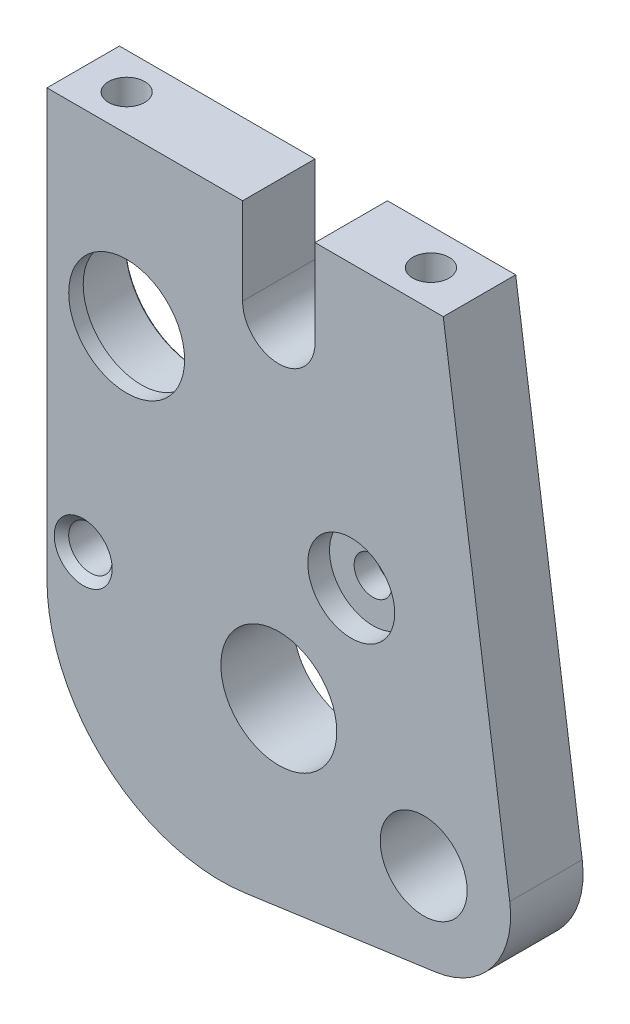
ISO-10303-21;
HEADER;
FILE_DESCRIPTION(('STEP AP214'),'2;1');
FILE_NAME('part.step','',(''),(''),'','','');
FILE_SCHEMA(('AUTOMOTIVE_DESIGN { 1 0 10303 214 1 1 1 1 }'));
ENDSEC;
DATA;
#1=APPLICATION_CONTEXT('core data for automotive mechanical design processes');
#2=APPLICATION_PROTOCOL_DEFINITION('international standard','automotive_design',2000,#1);
#3=PRODUCT_CONTEXT('',#1,'mechanical');
#4=PRODUCT('Part','Part','',(#3));
#5=PRODUCT_RELATED_PRODUCT_CATEGORY('part','',(#4));
#6=PRODUCT_DEFINITION_FORMATION('','',#4);
#7=PRODUCT_DEFINITION_CONTEXT('part definition',#1,'design');
#8=PRODUCT_DEFINITION('design','',#6,#7);
#9=PRODUCT_DEFINITION_SHAPE('','',#8);
#10=(LENGTH_UNIT() NAMED_UNIT(*) SI_UNIT(.MILLI.,.METRE.));
#11=(NAMED_UNIT(*) PLANE_ANGLE_UNIT() SI_UNIT($,.RADIAN.));
#12=(NAMED_UNIT(*) SI_UNIT($,.STERADIAN.) SOLID_ANGLE_UNIT());
#13=UNCERTAINTY_MEASURE_WITH_UNIT(LENGTH_MEASURE(1.E-05),#10,'distance_accuracy_value','');
#14=(GEOMETRIC_REPRESENTATION_CONTEXT(3) GLOBAL_UNCERTAINTY_ASSIGNED_CONTEXT((#13)) GLOBAL_UNIT_ASSIGNED_CONTEXT((#10,
#11,#12)) REPRESENTATION_CONTEXT('',''));
#15=CARTESIAN_POINT('',(0.,0.,0.));
#16=DIRECTION('',(0.,0.,1.));
#17=DIRECTION('',(1.,0.,0.));
#18=AXIS2_PLACEMENT_3D('',#15,#16,#17);
#19=CARTESIAN_POINT('',(0.,0.,5.));
#20=DIRECTION('',(0.,-1.,0.));
#21=DIRECTION('',(0.,0.,-1.));
#22=AXIS2_PLACEMENT_3D('',#19,#20,#21);
#23=PLANE('',#22);
#24=CARTESIAN_POINT('',(24.,0.,2.5));
#25=DIRECTION('',(0.,1.,0.));
#26=DIRECTION('',(0.,0.,1.));
#27=AXIS2_PLACEMENT_3D('',#24,#25,#26);
#28=CIRCLE('',#27,1.25);
#29=CARTESIAN_POINT('',(24.,0.,3.75));
#30=VERTEX_POINT('',#29);
#31=EDGE_CURVE('E719',#30,#30,#28,.T.);
#32=ORIENTED_EDGE('',*,*,#31,.F.);
#33=EDGE_LOOP('',(#32));
#34=FACE_BOUND('',#33,.T.);
#35=DIRECTION('',(-1.,0.,0.));
#36=VECTOR('',#35,1.);
#37=CARTESIAN_POINT('',(0.,0.,0.));
#38=LINE('',#37,#36);
#39=CARTESIAN_POINT('',(27.3508474725816,0.,0.));
#40=VERTEX_POINT('',#39);
#41=CARTESIAN_POINT('',(18.5,0.,0.));
#42=VERTEX_POINT('',#41);
#43=EDGE_CURVE('E319',#40,#42,#38,.T.);
#44=ORIENTED_EDGE('',*,*,#43,.T.);
#45=DIRECTION('',(0.,0.,-1.));
#46=VECTOR('',#45,1.);
#47=CARTESIAN_POINT('',(18.5,0.,5.));
#48=LINE('',#47,#46);
#49=CARTESIAN_POINT('',(18.5,0.,5.));
#50=VERTEX_POINT('',#49);
#51=EDGE_CURVE('E194',#50,#42,#48,.T.);
#52=ORIENTED_EDGE('',*,*,#51,.F.);
#53=DIRECTION('',(-1.,0.,0.));
#54=VECTOR('',#53,1.);
#55=CARTESIAN_POINT('',(0.,0.,5.));
#56=LINE('',#55,#54);
#57=CARTESIAN_POINT('',(27.3508474725816,0.,5.));
#58=VERTEX_POINT('',#57);
#59=EDGE_CURVE('E320',#58,#50,#56,.T.);
#60=ORIENTED_EDGE('',*,*,#59,.F.);
#61=DIRECTION('',(0.,0.,-1.));
#62=VECTOR('',#61,1.);
#63=CARTESIAN_POINT('',(27.3508474725816,0.,10.));
#64=LINE('',#63,#62);
#65=EDGE_CURVE('E293',#58,#40,#64,.T.);
#66=ORIENTED_EDGE('',*,*,#65,.T.);
#67=EDGE_LOOP('',(#44,#52,#60,#66));
#68=FACE_BOUND('',#67,.T.);
#69=ADVANCED_FACE('F34',(#34,#68),#23,.F.);
#70=CARTESIAN_POINT('',(2.5,-26.5,0.5));
#71=DIRECTION('',(0.,0.,1.));
#72=DIRECTION('',(1.,0.,0.));
#73=AXIS2_PLACEMENT_3D('',#70,#71,#72);
#74=CYLINDRICAL_SURFACE('',#73,1.5);
#75=CARTESIAN_POINT('',(2.5,-26.5,4.5));
#76=DIRECTION('',(0.,0.,1.));
#77=DIRECTION('',(1.,0.,0.));
#78=AXIS2_PLACEMENT_3D('',#75,#76,#77);
#79=CIRCLE('',#78,1.5);
#80=CARTESIAN_POINT('',(4.,-26.5,4.5));
#81=VERTEX_POINT('',#80);
#82=EDGE_CURVE('E42',#81,#81,#79,.T.);
#83=ORIENTED_EDGE('',*,*,#82,.T.);
#84=EDGE_LOOP('',(#83));
#85=FACE_BOUND('',#84,.T.);
#86=CARTESIAN_POINT('',(2.5,-26.5,0.));
#87=DIRECTION('',(0.,0.,1.));
#88=DIRECTION('',(1.,0.,0.));
#89=AXIS2_PLACEMENT_3D('',#86,#87,#88);
#90=CIRCLE('',#89,1.5);
#91=CARTESIAN_POINT('',(4.,-26.5,0.));
#92=VERTEX_POINT('',#91);
#93=EDGE_CURVE('E185',#92,#92,#90,.T.);
#94=ORIENTED_EDGE('',*,*,#93,.F.);
#95=EDGE_LOOP('',(#94));
#96=FACE_BOUND('',#95,.T.);
#97=ADVANCED_FACE('F343',(#85,#96),#74,.F.);
#98=CARTESIAN_POINT('',(5.5,-11.5,16.3137084989848));
#99=DIRECTION('',(0.,0.,-1.));
#100=DIRECTION('',(-1.,0.,0.));
#101=AXIS2_PLACEMENT_3D('',#98,#99,#100);
#102=CYLINDRICAL_SURFACE('',#101,4.);
#103=CARTESIAN_POINT('',(5.5,-11.5,5.));
#104=DIRECTION('',(0.,0.,1.));
#105=DIRECTION('',(1.,0.,0.));
#106=AXIS2_PLACEMENT_3D('',#103,#104,#105);
#107=CIRCLE('',#106,4.);
#108=CARTESIAN_POINT('',(9.5,-11.5,5.));
#109=VERTEX_POINT('',#108);
#110=EDGE_CURVE('E306',#109,#109,#107,.F.);
#111=ORIENTED_EDGE('',*,*,#110,.F.);
#112=EDGE_LOOP('',(#111));
#113=FACE_BOUND('',#112,.T.);
#114=CARTESIAN_POINT('',(5.5,-11.5,4.));
#115=DIRECTION('',(0.,0.,-1.));
#116=DIRECTION('',(-1.,0.,0.));
#117=AXIS2_PLACEMENT_3D('',#114,#115,#116);
#118=CIRCLE('',#117,4.);
#119=CARTESIAN_POINT('',(1.5,-11.5,4.));
#120=VERTEX_POINT('',#119);
#121=EDGE_CURVE('E305',#120,#120,#118,.F.);
#122=ORIENTED_EDGE('',*,*,#121,.F.);
#123=EDGE_LOOP('',(#122));
#124=FACE_BOUND('',#123,.T.);
#125=ADVANCED_FACE('F366',(#113,#124),#102,.F.);
#126=CARTESIAN_POINT('',(0.,0.,5.));
#127=DIRECTION('',(1.,0.,0.));
#128=DIRECTION('',(0.,1.,0.));
#129=AXIS2_PLACEMENT_3D('',#126,#127,#128);
#130=PLANE('',#129);
#131=DIRECTION('',(0.,-1.,0.));
#132=VECTOR('',#131,1.);
#133=CARTESIAN_POINT('',(0.,0.,0.));
#134=LINE('',#133,#132);
#135=CARTESIAN_POINT('',(0.,0.,0.));
#136=VERTEX_POINT('',#135);
#137=CARTESIAN_POINT('',(0.,-29.4086062507216,0.));
#138=VERTEX_POINT('',#137);
#139=EDGE_CURVE('E315',#136,#138,#134,.T.);
#140=ORIENTED_EDGE('',*,*,#139,.T.);
#141=DIRECTION('',(0.,0.,1.));
#142=VECTOR('',#141,1.);
#143=CARTESIAN_POINT('',(0.,-29.4086062507216,-32.9920643395448));
#144=LINE('',#143,#142);
#145=CARTESIAN_POINT('',(0.,-29.4086062507216,5.));
#146=VERTEX_POINT('',#145);
#147=EDGE_CURVE('E282',#138,#146,#144,.T.);
#148=ORIENTED_EDGE('',*,*,#147,.T.);
#149=DIRECTION('',(0.,-1.,0.));
#150=VECTOR('',#149,1.);
#151=CARTESIAN_POINT('',(0.,0.,5.));
#152=LINE('',#151,#150);
#153=CARTESIAN_POINT('',(0.,0.,5.));
#154=VERTEX_POINT('',#153);
#155=EDGE_CURVE('E316',#154,#146,#152,.T.);
#156=ORIENTED_EDGE('',*,*,#155,.F.);
#157=DIRECTION('',(0.,0.,-1.));
#158=VECTOR('',#157,1.);
#159=CARTESIAN_POINT('',(0.,0.,5.));
#160=LINE('',#159,#158);
#161=EDGE_CURVE('E322',#154,#136,#160,.T.);
#162=ORIENTED_EDGE('',*,*,#161,.T.);
#163=EDGE_LOOP('',(#140,#148,#156,#162));
#164=FACE_BOUND('',#163,.T.);
#165=ADVANCED_FACE('F373',(#164),#130,.F.);
#166=CARTESIAN_POINT('',(3.,0.,2.5));
#167=DIRECTION('',(0.,1.,0.));
#168=DIRECTION('',(0.,0.,1.));
#169=AXIS2_PLACEMENT_3D('',#166,#167,#168);
#170=CIRCLE('',#169,1.25);
#171=CARTESIAN_POINT('',(3.,0.,3.75));
#172=VERTEX_POINT('',#171);
#173=EDGE_CURVE('E386',#172,#172,#170,.T.);
#174=ORIENTED_EDGE('',*,*,#173,.F.);
#175=EDGE_LOOP('',(#174));
#176=FACE_BOUND('',#175,.T.);
#177=CARTESIAN_POINT('',(13.5,0.,5.));
#178=VERTEX_POINT('',#177);
#179=EDGE_CURVE('E318',#178,#154,#56,.T.);
#180=ORIENTED_EDGE('',*,*,#179,.F.);
#181=DIRECTION('',(0.,0.,-1.));
#182=VECTOR('',#181,1.);
#183=CARTESIAN_POINT('',(13.5,0.,5.));
#184=LINE('',#183,#182);
#185=CARTESIAN_POINT('',(13.5,0.,0.));
#186=VERTEX_POINT('',#185);
#187=EDGE_CURVE('E166',#178,#186,#184,.T.);
#188=ORIENTED_EDGE('',*,*,#187,.T.);
#189=EDGE_CURVE('E324',#186,#136,#38,.T.);
#190=ORIENTED_EDGE('',*,*,#189,.T.);
#191=ORIENTED_EDGE('',*,*,#161,.F.);
#192=EDGE_LOOP('',(#180,#188,#190,#191));
#193=FACE_BOUND('',#192,.T.);
#194=ADVANCED_FACE('F362',(#176,#193),#23,.F.);
#195=CARTESIAN_POINT('',(0.,-39.5,5.));
#196=DIRECTION('',(0.,0.,1.));
#197=DIRECTION('',(1.,0.,0.));
#198=AXIS2_PLACEMENT_3D('',#195,#196,#197);
#199=PLANE('',#198);
#200=CARTESIAN_POINT('',(2.5,-26.5,5.));
#201=DIRECTION('',(0.,0.,1.));
#202=DIRECTION('',(1.,0.,0.));
#203=AXIS2_PLACEMENT_3D('',#200,#201,#202);
#204=CIRCLE('',#203,2.);
#205=CARTESIAN_POINT('',(4.5,-26.5,5.));
#206=VERTEX_POINT('',#205);
#207=EDGE_CURVE('E11',#206,#206,#204,.F.);
#208=ORIENTED_EDGE('',*,*,#207,.T.);
#209=EDGE_LOOP('',(#208));
#210=FACE_BOUND('',#209,.T.);
#211=DIRECTION('',(0.,-1.,0.));
#212=VECTOR('',#211,1.);
#213=CARTESIAN_POINT('',(18.5,0.,5.));
#214=LINE('',#213,#212);
#215=CARTESIAN_POINT('',(18.5,-6.,5.));
#216=VERTEX_POINT('',#215);
#217=EDGE_CURVE('E167',#50,#216,#214,.T.);
#218=ORIENTED_EDGE('',*,*,#217,.T.);
#219=CARTESIAN_POINT('',(16.,-6.,5.));
#220=DIRECTION('',(0.,0.,-1.));
#221=DIRECTION('',(-1.,0.,0.));
#222=AXIS2_PLACEMENT_3D('',#219,#220,#221);
#223=CIRCLE('',#222,2.5);
#224=CARTESIAN_POINT('',(13.5,-6.,5.));
#225=VERTEX_POINT('',#224);
#226=EDGE_CURVE('E162',#216,#225,#223,.T.);
#227=ORIENTED_EDGE('',*,*,#226,.T.);
#228=DIRECTION('',(0.,1.,0.));
#229=VECTOR('',#228,1.);
#230=CARTESIAN_POINT('',(13.5,-6.,5.));
#231=LINE('',#230,#229);
#232=EDGE_CURVE('E170',#225,#178,#231,.T.);
#233=ORIENTED_EDGE('',*,*,#232,.T.);
#234=ORIENTED_EDGE('',*,*,#179,.T.);
#235=ORIENTED_EDGE('',*,*,#155,.T.);
#236=CARTESIAN_POINT('',(12.,-29.4086062507216,5.));
#237=DIRECTION('',(0.,0.,1.));
#238=DIRECTION('',(-1.,0.,0.));
#239=AXIS2_PLACEMENT_3D('',#236,#237,#238);
#240=CIRCLE('',#239,12.);
#241=CARTESIAN_POINT('',(13.6700772115207,-41.2918230756205,5.));
#242=VERTEX_POINT('',#241);
#243=EDGE_CURVE('E276',#146,#242,#240,.T.);
#244=ORIENTED_EDGE('',*,*,#243,.T.);
#245=DIRECTION('',(0.990268068741572,0.139173100960055,0.));
#246=VECTOR('',#245,1.);
#247=CARTESIAN_POINT('',(26.8350386057603,-39.4416084124494,5.));
#248=LINE('',#247,#246);
#249=CARTESIAN_POINT('',(26.8350386057603,-39.4416084124494,5.));
#250=VERTEX_POINT('',#249);
#251=EDGE_CURVE('E279',#242,#250,#248,.T.);
#252=ORIENTED_EDGE('',*,*,#251,.T.);
#253=CARTESIAN_POINT('',(26.,-33.5,5.));
#254=DIRECTION('',(0.,0.,1.));
#255=DIRECTION('',(1.,0.,0.));
#256=AXIS2_PLACEMENT_3D('',#253,#254,#255);
#257=CIRCLE('',#256,5.99999999999997);
#258=CARTESIAN_POINT('',(31.9416084124494,-32.6649613942396,5.));
#259=VERTEX_POINT('',#258);
#260=EDGE_CURVE('E300',#259,#250,#257,.F.);
#261=ORIENTED_EDGE('',*,*,#260,.F.);
#262=DIRECTION('',(0.139173100960066,-0.99026806874157,0.));
#263=VECTOR('',#262,1.);
#264=CARTESIAN_POINT('',(32.2649225270986,-34.9654608564336,5.));
#265=LINE('',#264,#263);
#266=EDGE_CURVE('E296',#58,#259,#265,.T.);
#267=ORIENTED_EDGE('',*,*,#266,.F.);
#268=ORIENTED_EDGE('',*,*,#59,.T.);
#269=EDGE_LOOP('',(#218,#227,#233,#234,#235,#244,#252,#261,#267,#268));
#270=FACE_BOUND('',#269,.T.);
#271=CARTESIAN_POINT('',(21.,-19.4,5.));
#272=DIRECTION('',(0.,0.,1.));
#273=DIRECTION('',(1.,0.,0.));
#274=AXIS2_PLACEMENT_3D('',#271,#272,#273);
#275=CIRCLE('',#274,3.);
#276=CARTESIAN_POINT('',(24.,-19.4,5.));
#277=VERTEX_POINT('',#276);
#278=EDGE_CURVE('E224',#277,#277,#275,.T.);
#279=ORIENTED_EDGE('',*,*,#278,.F.);
#280=EDGE_LOOP('',(#279));
#281=FACE_BOUND('',#280,.T.);
#282=CARTESIAN_POINT('',(16.,-28.5,5.));
#283=DIRECTION('',(0.,0.,1.));
#284=DIRECTION('',(1.,0.,0.));
#285=AXIS2_PLACEMENT_3D('',#282,#283,#284);
#286=CIRCLE('',#285,4.);
#287=CARTESIAN_POINT('',(20.,-28.5,5.));
#288=VERTEX_POINT('',#287);
#289=EDGE_CURVE('E259',#288,#288,#286,.T.);
#290=ORIENTED_EDGE('',*,*,#289,.F.);
#291=EDGE_LOOP('',(#290));
#292=FACE_BOUND('',#291,.T.);
#293=ORIENTED_EDGE('',*,*,#110,.T.);
#294=EDGE_LOOP('',(#293));
#295=FACE_BOUND('',#294,.T.);
#296=CARTESIAN_POINT('',(26.,-33.5,5.));
#297=DIRECTION('',(0.,0.,1.));
#298=DIRECTION('',(1.,0.,0.));
#299=AXIS2_PLACEMENT_3D('',#296,#297,#298);
#300=CIRCLE('',#299,3.);
#301=CARTESIAN_POINT('',(29.,-33.5,5.));
#302=VERTEX_POINT('',#301);
#303=EDGE_CURVE('E309',#302,#302,#300,.T.);
#304=ORIENTED_EDGE('',*,*,#303,.F.);
#305=EDGE_LOOP('',(#304));
#306=FACE_BOUND('',#305,.T.);
#307=ADVANCED_FACE('F176',(#210,#270,#281,#292,#295,#306),#199,.T.);
#308=CARTESIAN_POINT('',(0.,-39.5,0.));
#309=DIRECTION('',(0.,0.,1.));
#310=DIRECTION('',(1.,0.,0.));
#311=AXIS2_PLACEMENT_3D('',#308,#309,#310);
#312=PLANE('',#311);
#313=CARTESIAN_POINT('',(5.5,-11.5,0.));
#314=DIRECTION('',(0.,0.,1.));
#315=DIRECTION('',(1.,0.,0.));
#316=AXIS2_PLACEMENT_3D('',#313,#314,#315);
#317=CIRCLE('',#316,5.1);
#318=CARTESIAN_POINT('',(10.6,-11.5,0.));
#319=VERTEX_POINT('',#318);
#320=EDGE_CURVE('E338',#319,#319,#317,.T.);
#321=ORIENTED_EDGE('',*,*,#320,.T.);
#322=EDGE_LOOP('',(#321));
#323=FACE_BOUND('',#322,.T.);
#324=DIRECTION('',(0.,1.,0.));
#325=VECTOR('',#324,1.);
#326=CARTESIAN_POINT('',(18.,-21.9,0.));
#327=LINE('',#326,#325);
#328=CARTESIAN_POINT('',(18.,-18.9,0.));
#329=VERTEX_POINT('',#328);
#330=CARTESIAN_POINT('',(18.,-17.9,0.));
#331=VERTEX_POINT('',#330);
#332=EDGE_CURVE('E247',#329,#331,#327,.T.);
#333=ORIENTED_EDGE('',*,*,#332,.F.);
#334=CARTESIAN_POINT('',(18.,-20.4,0.));
#335=DIRECTION('',(0.,0.,-1.));
#336=DIRECTION('',(-1.,0.,0.));
#337=AXIS2_PLACEMENT_3D('',#334,#335,#336);
#338=CIRCLE('',#337,1.5);
#339=CARTESIAN_POINT('',(18.,-21.9,0.));
#340=VERTEX_POINT('',#339);
#341=EDGE_CURVE('E193',#340,#329,#338,.T.);
#342=ORIENTED_EDGE('',*,*,#341,.F.);
#343=DIRECTION('',(-1.,0.,0.));
#344=VECTOR('',#343,1.);
#345=CARTESIAN_POINT('',(18.,-21.9,0.));
#346=LINE('',#345,#344);
#347=CARTESIAN_POINT('',(24.,-21.9,0.));
#348=VERTEX_POINT('',#347);
#349=EDGE_CURVE('E237',#348,#340,#346,.T.);
#350=ORIENTED_EDGE('',*,*,#349,.F.);
#351=CARTESIAN_POINT('',(24.,-20.4,0.));
#352=DIRECTION('',(0.,0.,-1.));
#353=DIRECTION('',(-1.,0.,0.));
#354=AXIS2_PLACEMENT_3D('',#351,#352,#353);
#355=CIRCLE('',#354,1.5);
#356=CARTESIAN_POINT('',(24.,-18.9,0.));
#357=VERTEX_POINT('',#356);
#358=EDGE_CURVE('E203',#357,#348,#355,.T.);
#359=ORIENTED_EDGE('',*,*,#358,.F.);
#360=DIRECTION('',(0.,-1.,0.));
#361=VECTOR('',#360,1.);
#362=CARTESIAN_POINT('',(24.,-21.9,0.));
#363=LINE('',#362,#361);
#364=CARTESIAN_POINT('',(24.,-17.9,0.));
#365=VERTEX_POINT('',#364);
#366=EDGE_CURVE('E252',#365,#357,#363,.T.);
#367=ORIENTED_EDGE('',*,*,#366,.F.);
#368=CARTESIAN_POINT('',(24.,-16.4,0.));
#369=DIRECTION('',(0.,0.,-1.));
#370=DIRECTION('',(-1.,0.,0.));
#371=AXIS2_PLACEMENT_3D('',#368,#369,#370);
#372=CIRCLE('',#371,1.5);
#373=CARTESIAN_POINT('',(24.,-14.9,0.));
#374=VERTEX_POINT('',#373);
#375=EDGE_CURVE('E217',#374,#365,#372,.T.);
#376=ORIENTED_EDGE('',*,*,#375,.F.);
#377=DIRECTION('',(1.,0.,0.));
#378=VECTOR('',#377,1.);
#379=CARTESIAN_POINT('',(18.,-14.9,0.));
#380=LINE('',#379,#378);
#381=CARTESIAN_POINT('',(18.,-14.9,0.));
#382=VERTEX_POINT('',#381);
#383=EDGE_CURVE('E249',#382,#374,#380,.T.);
#384=ORIENTED_EDGE('',*,*,#383,.F.);
#385=CARTESIAN_POINT('',(18.,-16.4,0.));
#386=DIRECTION('',(0.,0.,-1.));
#387=DIRECTION('',(-1.,0.,0.));
#388=AXIS2_PLACEMENT_3D('',#385,#386,#387);
#389=CIRCLE('',#388,1.5);
#390=EDGE_CURVE('E57',#331,#382,#389,.T.);
#391=ORIENTED_EDGE('',*,*,#390,.F.);
#392=EDGE_LOOP('',(#333,#342,#350,#359,#367,#376,#384,#391));
#393=FACE_BOUND('',#392,.T.);
#394=CARTESIAN_POINT('',(16.,-28.5,0.));
#395=DIRECTION('',(0.,0.,1.));
#396=DIRECTION('',(1.,0.,0.));
#397=AXIS2_PLACEMENT_3D('',#394,#395,#396);
#398=CIRCLE('',#397,4.);
#399=CARTESIAN_POINT('',(20.,-28.5,0.));
#400=VERTEX_POINT('',#399);
#401=EDGE_CURVE('E268',#400,#400,#398,.T.);
#402=ORIENTED_EDGE('',*,*,#401,.T.);
#403=EDGE_LOOP('',(#402));
#404=FACE_BOUND('',#403,.T.);
#405=CARTESIAN_POINT('',(26.,-33.5,0.));
#406=DIRECTION('',(0.,0.,1.));
#407=DIRECTION('',(1.,0.,0.));
#408=AXIS2_PLACEMENT_3D('',#405,#406,#407);
#409=CIRCLE('',#408,3.);
#410=CARTESIAN_POINT('',(29.,-33.5,0.));
#411=VERTEX_POINT('',#410);
#412=EDGE_CURVE('E312',#411,#411,#409,.F.);
#413=ORIENTED_EDGE('',*,*,#412,.F.);
#414=EDGE_LOOP('',(#413));
#415=FACE_BOUND('',#414,.T.);
#416=CARTESIAN_POINT('',(16.,-6.,0.));
#417=DIRECTION('',(0.,0.,-1.));
#418=DIRECTION('',(-1.,0.,0.));
#419=AXIS2_PLACEMENT_3D('',#416,#417,#418);
#420=CIRCLE('',#419,2.5);
#421=CARTESIAN_POINT('',(18.5,-6.,0.));
#422=VERTEX_POINT('',#421);
#423=CARTESIAN_POINT('',(13.5,-6.,0.));
#424=VERTEX_POINT('',#423);
#425=EDGE_CURVE('E49',#422,#424,#420,.T.);
#426=ORIENTED_EDGE('',*,*,#425,.F.);
#427=DIRECTION('',(0.,-1.,0.));
#428=VECTOR('',#427,1.);
#429=CARTESIAN_POINT('',(18.5,0.,0.));
#430=LINE('',#429,#428);
#431=EDGE_CURVE('E179',#42,#422,#430,.T.);
#432=ORIENTED_EDGE('',*,*,#431,.F.);
#433=ORIENTED_EDGE('',*,*,#43,.F.);
#434=DIRECTION('',(-0.139173100960066,0.99026806874157,0.));
#435=VECTOR('',#434,1.);
#436=CARTESIAN_POINT('',(31.9416084124494,-32.6649613942396,0.));
#437=LINE('',#436,#435);
#438=CARTESIAN_POINT('',(31.9416084124494,-32.6649613942396,0.));
#439=VERTEX_POINT('',#438);
#440=EDGE_CURVE('E290',#439,#40,#437,.T.);
#441=ORIENTED_EDGE('',*,*,#440,.F.);
#442=CARTESIAN_POINT('',(26.,-33.5,0.));
#443=DIRECTION('',(0.,0.,1.));
#444=DIRECTION('',(-1.,0.,0.));
#445=AXIS2_PLACEMENT_3D('',#442,#443,#444);
#446=CIRCLE('',#445,5.99999999999997);
#447=CARTESIAN_POINT('',(26.8350386057603,-39.4416084124494,0.));
#448=VERTEX_POINT('',#447);
#449=EDGE_CURVE('E275',#448,#439,#446,.T.);
#450=ORIENTED_EDGE('',*,*,#449,.F.);
#451=DIRECTION('',(-0.990268068741572,-0.139173100960055,0.));
#452=VECTOR('',#451,1.);
#453=CARTESIAN_POINT('',(26.8350386057603,-39.4416084124494,0.));
#454=LINE('',#453,#452);
#455=CARTESIAN_POINT('',(13.6700772115207,-41.2918230756205,0.));
#456=VERTEX_POINT('',#455);
#457=EDGE_CURVE('E272',#448,#456,#454,.T.);
#458=ORIENTED_EDGE('',*,*,#457,.T.);
#459=CARTESIAN_POINT('',(12.,-29.4086062507216,0.));
#460=DIRECTION('',(0.,0.,1.));
#461=DIRECTION('',(1.,0.,0.));
#462=AXIS2_PLACEMENT_3D('',#459,#460,#461);
#463=CIRCLE('',#462,12.);
#464=EDGE_CURVE('E269',#456,#138,#463,.F.);
#465=ORIENTED_EDGE('',*,*,#464,.T.);
#466=ORIENTED_EDGE('',*,*,#139,.F.);
#467=ORIENTED_EDGE('',*,*,#189,.F.);
#468=DIRECTION('',(0.,1.,0.));
#469=VECTOR('',#468,1.);
#470=CARTESIAN_POINT('',(13.5,-6.,0.));
#471=LINE('',#470,#469);
#472=EDGE_CURVE('E182',#424,#186,#471,.T.);
#473=ORIENTED_EDGE('',*,*,#472,.F.);
#474=EDGE_LOOP('',(#426,#432,#433,#441,#450,#458,#465,#466,#467,#473));
#475=FACE_BOUND('',#474,.T.);
#476=ORIENTED_EDGE('',*,*,#93,.T.);
#477=EDGE_LOOP('',(#476));
#478=FACE_BOUND('',#477,.T.);
#479=ADVANCED_FACE('F379',(#323,#393,#404,#415,#475,#478),#312,.F.);
#480=CARTESIAN_POINT('',(26.,-33.5,-8.48528137423856));
#481=DIRECTION('',(0.,0.,1.));
#482=DIRECTION('',(1.,0.,0.));
#483=AXIS2_PLACEMENT_3D('',#480,#481,#482);
#484=CYLINDRICAL_SURFACE('',#483,3.);
#485=ORIENTED_EDGE('',*,*,#412,.T.);
#486=EDGE_LOOP('',(#485));
#487=FACE_BOUND('',#486,.T.);
#488=ORIENTED_EDGE('',*,*,#303,.T.);
#489=EDGE_LOOP('',(#488));
#490=FACE_BOUND('',#489,.T.);
#491=ADVANCED_FACE('F491',(#487,#490),#484,.F.);
#492=CARTESIAN_POINT('',(5.5,-11.5,4.));
#493=DIRECTION('',(0.,0.,-1.));
#494=DIRECTION('',(-1.,0.,0.));
#495=AXIS2_PLACEMENT_3D('',#492,#493,#494);
#496=PLANE('',#495);
#497=CARTESIAN_POINT('',(5.5,-11.5,4.));
#498=DIRECTION('',(0.,0.,-1.));
#499=DIRECTION('',(-1.,0.,0.));
#500=AXIS2_PLACEMENT_3D('',#497,#498,#499);
#501=CIRCLE('',#500,5.);
#502=CARTESIAN_POINT('',(0.499999999999996,-11.5,4.));
#503=VERTEX_POINT('',#502);
#504=EDGE_CURVE('E302',#503,#503,#501,.T.);
#505=ORIENTED_EDGE('',*,*,#504,.T.);
#506=EDGE_LOOP('',(#505));
#507=FACE_BOUND('',#506,.T.);
#508=ORIENTED_EDGE('',*,*,#121,.T.);
#509=EDGE_LOOP('',(#508));
#510=FACE_BOUND('',#509,.T.);
#511=ADVANCED_FACE('F488',(#507,#510),#496,.T.);
#512=CARTESIAN_POINT('',(5.5,-11.5,4.));
#513=DIRECTION('',(0.,0.,-1.));
#514=DIRECTION('',(-1.,0.,0.));
#515=AXIS2_PLACEMENT_3D('',#512,#513,#514);
#516=CYLINDRICAL_SURFACE('',#515,5.);
#517=CARTESIAN_POINT('',(5.5,-11.5,0.1));
#518=DIRECTION('',(0.,0.,1.));
#519=DIRECTION('',(1.,0.,0.));
#520=AXIS2_PLACEMENT_3D('',#517,#518,#519);
#521=CIRCLE('',#520,5.);
#522=CARTESIAN_POINT('',(10.5,-11.5,0.1));
#523=VERTEX_POINT('',#522);
#524=EDGE_CURVE('E329',#523,#523,#521,.F.);
#525=ORIENTED_EDGE('',*,*,#524,.T.);
#526=EDGE_LOOP('',(#525));
#527=FACE_BOUND('',#526,.T.);
#528=ORIENTED_EDGE('',*,*,#504,.F.);
#529=EDGE_LOOP('',(#528));
#530=FACE_BOUND('',#529,.T.);
#531=ADVANCED_FACE('F487',(#527,#530),#516,.F.);
#532=CARTESIAN_POINT('',(26.,-33.5,10.));
#533=DIRECTION('',(0.,0.,-1.));
#534=DIRECTION('',(-1.,0.,0.));
#535=AXIS2_PLACEMENT_3D('',#532,#533,#534);
#536=CYLINDRICAL_SURFACE('',#535,5.99999999999997);
#537=ORIENTED_EDGE('',*,*,#260,.T.);
#538=DIRECTION('',(0.,0.,1.));
#539=VECTOR('',#538,1.);
#540=CARTESIAN_POINT('',(26.8350386057603,-39.4416084124494,-32.9920643395448));
#541=LINE('',#540,#539);
#542=EDGE_CURVE('E273',#448,#250,#541,.T.);
#543=ORIENTED_EDGE('',*,*,#542,.F.);
#544=ORIENTED_EDGE('',*,*,#449,.T.);
#545=DIRECTION('',(0.,0.,-1.));
#546=VECTOR('',#545,1.);
#547=CARTESIAN_POINT('',(31.9416084124494,-32.6649613942396,10.));
#548=LINE('',#547,#546);
#549=EDGE_CURVE('E292',#259,#439,#548,.T.);
#550=ORIENTED_EDGE('',*,*,#549,.F.);
#551=EDGE_LOOP('',(#537,#543,#544,#550));
#552=FACE_BOUND('',#551,.T.);
#553=ADVANCED_FACE('F407',(#552),#536,.T.);
#554=CARTESIAN_POINT('',(31.9416084124494,-32.6649613942396,10.));
#555=DIRECTION('',(-0.99026806874157,-0.139173100960066,0.));
#556=DIRECTION('',(0.139173100960066,-0.99026806874157,0.));
#557=AXIS2_PLACEMENT_3D('',#554,#555,#556);
#558=PLANE('',#557);
#559=ORIENTED_EDGE('',*,*,#266,.T.);
#560=ORIENTED_EDGE('',*,*,#549,.T.);
#561=ORIENTED_EDGE('',*,*,#440,.T.);
#562=ORIENTED_EDGE('',*,*,#65,.F.);
#563=EDGE_LOOP('',(#559,#560,#561,#562));
#564=FACE_BOUND('',#563,.T.);
#565=ADVANCED_FACE('F410',(#564),#558,.F.);
#566=CARTESIAN_POINT('',(26.8350386057603,-39.4416084124494,-32.9920643395448));
#567=DIRECTION('',(0.139173100960055,-0.990268068741572,0.));
#568=DIRECTION('',(0.990268068741572,0.139173100960055,0.));
#569=AXIS2_PLACEMENT_3D('',#566,#567,#568);
#570=PLANE('',#569);
#571=ORIENTED_EDGE('',*,*,#457,.F.);
#572=ORIENTED_EDGE('',*,*,#542,.T.);
#573=ORIENTED_EDGE('',*,*,#251,.F.);
#574=DIRECTION('',(0.,0.,1.));
#575=VECTOR('',#574,1.);
#576=CARTESIAN_POINT('',(13.6700772115207,-41.2918230756205,-32.9920643395448));
#577=LINE('',#576,#575);
#578=EDGE_CURVE('E285',#456,#242,#577,.T.);
#579=ORIENTED_EDGE('',*,*,#578,.F.);
#580=EDGE_LOOP('',(#571,#572,#573,#579));
#581=FACE_BOUND('',#580,.T.);
#582=ADVANCED_FACE('F400',(#581),#570,.T.);
#583=CARTESIAN_POINT('',(12.,-29.4086062507216,-32.9920643395448));
#584=DIRECTION('',(0.,0.,1.));
#585=DIRECTION('',(1.,0.,0.));
#586=AXIS2_PLACEMENT_3D('',#583,#584,#585);
#587=CYLINDRICAL_SURFACE('',#586,12.);
#588=ORIENTED_EDGE('',*,*,#464,.F.);
#589=ORIENTED_EDGE('',*,*,#578,.T.);
#590=ORIENTED_EDGE('',*,*,#243,.F.);
#591=ORIENTED_EDGE('',*,*,#147,.F.);
#592=EDGE_LOOP('',(#588,#589,#590,#591));
#593=FACE_BOUND('',#592,.T.);
#594=ADVANCED_FACE('F396',(#593),#587,.T.);
#595=CARTESIAN_POINT('',(16.,-28.5,-5.));
#596=DIRECTION('',(0.,0.,1.));
#597=DIRECTION('',(1.,0.,0.));
#598=AXIS2_PLACEMENT_3D('',#595,#596,#597);
#599=CYLINDRICAL_SURFACE('',#598,4.);
#600=ORIENTED_EDGE('',*,*,#289,.T.);
#601=EDGE_LOOP('',(#600));
#602=FACE_BOUND('',#601,.T.);
#603=ORIENTED_EDGE('',*,*,#401,.F.);
#604=EDGE_LOOP('',(#603));
#605=FACE_BOUND('',#604,.T.);
#606=ADVANCED_FACE('F474',(#602,#605),#599,.F.);
#607=CARTESIAN_POINT('',(18.,-21.9,2.));
#608=DIRECTION('',(-1.,0.,0.));
#609=DIRECTION('',(0.,0.,1.));
#610=AXIS2_PLACEMENT_3D('',#607,#608,#609);
#611=PLANE('',#610);
#612=DIRECTION('',(0.,1.,0.));
#613=VECTOR('',#612,1.);
#614=CARTESIAN_POINT('',(18.,-21.9,2.));
#615=LINE('',#614,#613);
#616=CARTESIAN_POINT('',(18.,-18.9,2.));
#617=VERTEX_POINT('',#616);
#618=CARTESIAN_POINT('',(18.,-17.9,2.));
#619=VERTEX_POINT('',#618);
#620=EDGE_CURVE('E234',#617,#619,#615,.T.);
#621=ORIENTED_EDGE('',*,*,#620,.F.);
#622=DIRECTION('',(0.,0.,-1.));
#623=VECTOR('',#622,1.);
#624=CARTESIAN_POINT('',(18.,-18.9,6.24264068711929));
#625=LINE('',#624,#623);
#626=EDGE_CURVE('E200',#617,#329,#625,.T.);
#627=ORIENTED_EDGE('',*,*,#626,.T.);
#628=ORIENTED_EDGE('',*,*,#332,.T.);
#629=DIRECTION('',(0.,0.,-1.));
#630=VECTOR('',#629,1.);
#631=CARTESIAN_POINT('',(18.,-17.9,6.24264068711929));
#632=LINE('',#631,#630);
#633=EDGE_CURVE('E214',#331,#619,#632,.F.);
#634=ORIENTED_EDGE('',*,*,#633,.T.);
#635=EDGE_LOOP('',(#621,#627,#628,#634));
#636=FACE_BOUND('',#635,.T.);
#637=ADVANCED_FACE('F464',(#636),#611,.F.);
#638=CARTESIAN_POINT('',(18.,-21.9,2.));
#639=DIRECTION('',(0.,-1.,0.));
#640=DIRECTION('',(0.,0.,-1.));
#641=AXIS2_PLACEMENT_3D('',#638,#639,#640);
#642=PLANE('',#641);
#643=ORIENTED_EDGE('',*,*,#349,.T.);
#644=DIRECTION('',(0.,0.,-1.));
#645=VECTOR('',#644,1.);
#646=CARTESIAN_POINT('',(18.,-21.9,2.));
#647=LINE('',#646,#645);
#648=CARTESIAN_POINT('',(18.,-21.9,2.));
#649=VERTEX_POINT('',#648);
#650=EDGE_CURVE('E257',#649,#340,#647,.T.);
#651=ORIENTED_EDGE('',*,*,#650,.F.);
#652=DIRECTION('',(-1.,0.,0.));
#653=VECTOR('',#652,1.);
#654=CARTESIAN_POINT('',(18.,-21.9,2.));
#655=LINE('',#654,#653);
#656=CARTESIAN_POINT('',(24.,-21.9,2.));
#657=VERTEX_POINT('',#656);
#658=EDGE_CURVE('E243',#657,#649,#655,.T.);
#659=ORIENTED_EDGE('',*,*,#658,.F.);
#660=DIRECTION('',(0.,0.,-1.));
#661=VECTOR('',#660,1.);
#662=CARTESIAN_POINT('',(24.,-21.9,2.));
#663=LINE('',#662,#661);
#664=EDGE_CURVE('E260',#657,#348,#663,.T.);
#665=ORIENTED_EDGE('',*,*,#664,.T.);
#666=EDGE_LOOP('',(#643,#651,#659,#665));
#667=FACE_BOUND('',#666,.T.);
#668=ADVANCED_FACE('F460',(#667),#642,.F.);
#669=CARTESIAN_POINT('',(24.,-21.9,2.));
#670=DIRECTION('',(1.,0.,0.));
#671=DIRECTION('',(0.,0.,-1.));
#672=AXIS2_PLACEMENT_3D('',#669,#670,#671);
#673=PLANE('',#672);
#674=ORIENTED_EDGE('',*,*,#366,.T.);
#675=DIRECTION('',(0.,0.,-1.));
#676=VECTOR('',#675,1.);
#677=CARTESIAN_POINT('',(24.,-18.9,6.24264068711929));
#678=LINE('',#677,#676);
#679=CARTESIAN_POINT('',(24.,-18.9,2.));
#680=VERTEX_POINT('',#679);
#681=EDGE_CURVE('E207',#357,#680,#678,.F.);
#682=ORIENTED_EDGE('',*,*,#681,.T.);
#683=DIRECTION('',(0.,-1.,0.));
#684=VECTOR('',#683,1.);
#685=CARTESIAN_POINT('',(24.,-21.9,2.));
#686=LINE('',#685,#684);
#687=CARTESIAN_POINT('',(24.,-17.9,2.));
#688=VERTEX_POINT('',#687);
#689=EDGE_CURVE('E240',#688,#680,#686,.T.);
#690=ORIENTED_EDGE('',*,*,#689,.F.);
#691=DIRECTION('',(0.,0.,-1.));
#692=VECTOR('',#691,1.);
#693=CARTESIAN_POINT('',(24.,-17.9,6.24264068711929));
#694=LINE('',#693,#692);
#695=EDGE_CURVE('E221',#688,#365,#694,.T.);
#696=ORIENTED_EDGE('',*,*,#695,.T.);
#697=EDGE_LOOP('',(#674,#682,#690,#696));
#698=FACE_BOUND('',#697,.T.);
#699=ADVANCED_FACE('F463',(#698),#673,.F.);
#700=CARTESIAN_POINT('',(18.,-14.9,2.));
#701=DIRECTION('',(0.,1.,0.));
#702=DIRECTION('',(0.,0.,1.));
#703=AXIS2_PLACEMENT_3D('',#700,#701,#702);
#704=PLANE('',#703);
#705=ORIENTED_EDGE('',*,*,#383,.T.);
#706=DIRECTION('',(0.,0.,-1.));
#707=VECTOR('',#706,1.);
#708=CARTESIAN_POINT('',(24.,-14.9,2.));
#709=LINE('',#708,#707);
#710=CARTESIAN_POINT('',(24.,-14.9,2.));
#711=VERTEX_POINT('',#710);
#712=EDGE_CURVE('E263',#711,#374,#709,.T.);
#713=ORIENTED_EDGE('',*,*,#712,.F.);
#714=DIRECTION('',(1.,0.,0.));
#715=VECTOR('',#714,1.);
#716=CARTESIAN_POINT('',(18.,-14.9,2.));
#717=LINE('',#716,#715);
#718=CARTESIAN_POINT('',(18.,-14.9,2.));
#719=VERTEX_POINT('',#718);
#720=EDGE_CURVE('E236',#719,#711,#717,.T.);
#721=ORIENTED_EDGE('',*,*,#720,.F.);
#722=DIRECTION('',(0.,0.,-1.));
#723=VECTOR('',#722,1.);
#724=CARTESIAN_POINT('',(18.,-14.9,2.));
#725=LINE('',#724,#723);
#726=EDGE_CURVE('E246',#719,#382,#725,.T.);
#727=ORIENTED_EDGE('',*,*,#726,.T.);
#728=EDGE_LOOP('',(#705,#713,#721,#727));
#729=FACE_BOUND('',#728,.T.);
#730=ADVANCED_FACE('F458',(#729),#704,.F.);
#731=CARTESIAN_POINT('',(18.,-14.9,2.));
#732=DIRECTION('',(0.,0.,-1.));
#733=DIRECTION('',(-1.,0.,0.));
#734=AXIS2_PLACEMENT_3D('',#731,#732,#733);
#735=PLANE('',#734);
#736=ORIENTED_EDGE('',*,*,#658,.T.);
#737=CARTESIAN_POINT('',(18.,-20.4,2.));
#738=DIRECTION('',(0.,0.,-1.));
#739=DIRECTION('',(-1.,0.,0.));
#740=AXIS2_PLACEMENT_3D('',#737,#738,#739);
#741=CIRCLE('',#740,1.5);
#742=EDGE_CURVE('E198',#617,#649,#741,.F.);
#743=ORIENTED_EDGE('',*,*,#742,.F.);
#744=ORIENTED_EDGE('',*,*,#620,.T.);
#745=CARTESIAN_POINT('',(18.,-16.4,2.));
#746=DIRECTION('',(0.,0.,-1.));
#747=DIRECTION('',(-1.,0.,0.));
#748=AXIS2_PLACEMENT_3D('',#745,#746,#747);
#749=CIRCLE('',#748,1.5);
#750=EDGE_CURVE('E211',#719,#619,#749,.F.);
#751=ORIENTED_EDGE('',*,*,#750,.F.);
#752=ORIENTED_EDGE('',*,*,#720,.T.);
#753=CARTESIAN_POINT('',(24.,-16.4,2.));
#754=DIRECTION('',(0.,0.,-1.));
#755=DIRECTION('',(-1.,0.,0.));
#756=AXIS2_PLACEMENT_3D('',#753,#754,#755);
#757=CIRCLE('',#756,1.5);
#758=EDGE_CURVE('E219',#688,#711,#757,.F.);
#759=ORIENTED_EDGE('',*,*,#758,.F.);
#760=ORIENTED_EDGE('',*,*,#689,.T.);
#761=CARTESIAN_POINT('',(24.,-20.4,2.));
#762=DIRECTION('',(0.,0.,-1.));
#763=DIRECTION('',(-1.,0.,0.));
#764=AXIS2_PLACEMENT_3D('',#761,#762,#763);
#765=CIRCLE('',#764,1.5);
#766=EDGE_CURVE('E205',#657,#680,#765,.F.);
#767=ORIENTED_EDGE('',*,*,#766,.F.);
#768=EDGE_LOOP('',(#736,#743,#744,#751,#752,#759,#760,#767));
#769=FACE_BOUND('',#768,.T.);
#770=CARTESIAN_POINT('',(21.,-19.4,2.));
#771=DIRECTION('',(0.,0.,-1.));
#772=DIRECTION('',(-1.,0.,0.));
#773=AXIS2_PLACEMENT_3D('',#770,#771,#772);
#774=CIRCLE('',#773,1.30000000000001);
#775=CARTESIAN_POINT('',(19.7,-19.4,2.));
#776=VERTEX_POINT('',#775);
#777=EDGE_CURVE('E233',#776,#776,#774,.T.);
#778=ORIENTED_EDGE('',*,*,#777,.F.);
#779=EDGE_LOOP('',(#778));
#780=FACE_BOUND('',#779,.T.);
#781=ADVANCED_FACE('F454',(#769,#780),#735,.T.);
#782=CARTESIAN_POINT('',(21.,-19.4,5.));
#783=DIRECTION('',(0.,0.,1.));
#784=DIRECTION('',(1.,0.,0.));
#785=AXIS2_PLACEMENT_3D('',#782,#783,#784);
#786=CYLINDRICAL_SURFACE('',#785,1.30000000000001);
#787=ORIENTED_EDGE('',*,*,#777,.T.);
#788=EDGE_LOOP('',(#787));
#789=FACE_BOUND('',#788,.T.);
#790=CARTESIAN_POINT('',(21.,-19.4,3.5));
#791=DIRECTION('',(0.,0.,1.));
#792=DIRECTION('',(1.,0.,0.));
#793=AXIS2_PLACEMENT_3D('',#790,#791,#792);
#794=CIRCLE('',#793,1.30000000000001);
#795=CARTESIAN_POINT('',(22.3,-19.4,3.5));
#796=VERTEX_POINT('',#795);
#797=EDGE_CURVE('E230',#796,#796,#794,.T.);
#798=ORIENTED_EDGE('',*,*,#797,.T.);
#799=EDGE_LOOP('',(#798));
#800=FACE_BOUND('',#799,.T.);
#801=ADVANCED_FACE('F450',(#789,#800),#786,.F.);
#802=CARTESIAN_POINT('',(22.3,-19.4,3.5));
#803=DIRECTION('',(0.,0.,-1.));
#804=DIRECTION('',(-1.,0.,0.));
#805=AXIS2_PLACEMENT_3D('',#802,#803,#804);
#806=PLANE('',#805);
#807=ORIENTED_EDGE('',*,*,#797,.F.);
#808=EDGE_LOOP('',(#807));
#809=FACE_BOUND('',#808,.T.);
#810=CARTESIAN_POINT('',(21.,-19.4,3.5));
#811=DIRECTION('',(0.,0.,1.));
#812=DIRECTION('',(1.,0.,0.));
#813=AXIS2_PLACEMENT_3D('',#810,#811,#812);
#814=CIRCLE('',#813,3.);
#815=CARTESIAN_POINT('',(24.,-19.4,3.5));
#816=VERTEX_POINT('',#815);
#817=EDGE_CURVE('E227',#816,#816,#814,.T.);
#818=ORIENTED_EDGE('',*,*,#817,.T.);
#819=EDGE_LOOP('',(#818));
#820=FACE_BOUND('',#819,.T.);
#821=ADVANCED_FACE('F446',(#809,#820),#806,.F.);
#822=CARTESIAN_POINT('',(21.,-19.4,5.));
#823=DIRECTION('',(0.,0.,1.));
#824=DIRECTION('',(1.,0.,0.));
#825=AXIS2_PLACEMENT_3D('',#822,#823,#824);
#826=CYLINDRICAL_SURFACE('',#825,3.);
#827=ORIENTED_EDGE('',*,*,#817,.F.);
#828=EDGE_LOOP('',(#827));
#829=FACE_BOUND('',#828,.T.);
#830=ORIENTED_EDGE('',*,*,#278,.T.);
#831=EDGE_LOOP('',(#830));
#832=FACE_BOUND('',#831,.T.);
#833=ADVANCED_FACE('F442',(#829,#832),#826,.F.);
#834=CARTESIAN_POINT('',(24.,-16.4,6.24264068711929));
#835=DIRECTION('',(0.,0.,-1.));
#836=DIRECTION('',(-1.,0.,0.));
#837=AXIS2_PLACEMENT_3D('',#834,#835,#836);
#838=CYLINDRICAL_SURFACE('',#837,1.5);
#839=ORIENTED_EDGE('',*,*,#758,.T.);
#840=ORIENTED_EDGE('',*,*,#712,.T.);
#841=ORIENTED_EDGE('',*,*,#375,.T.);
#842=ORIENTED_EDGE('',*,*,#695,.F.);
#843=EDGE_LOOP('',(#839,#840,#841,#842));
#844=FACE_BOUND('',#843,.T.);
#845=ADVANCED_FACE('F439',(#844),#838,.F.);
#846=CARTESIAN_POINT('',(18.,-16.4,6.24264068711929));
#847=DIRECTION('',(0.,0.,-1.));
#848=DIRECTION('',(-1.,0.,0.));
#849=AXIS2_PLACEMENT_3D('',#846,#847,#848);
#850=CYLINDRICAL_SURFACE('',#849,1.5);
#851=ORIENTED_EDGE('',*,*,#390,.T.);
#852=ORIENTED_EDGE('',*,*,#726,.F.);
#853=ORIENTED_EDGE('',*,*,#750,.T.);
#854=ORIENTED_EDGE('',*,*,#633,.F.);
#855=EDGE_LOOP('',(#851,#852,#853,#854));
#856=FACE_BOUND('',#855,.T.);
#857=ADVANCED_FACE('F435',(#856),#850,.F.);
#858=CARTESIAN_POINT('',(24.,-20.4,6.24264068711929));
#859=DIRECTION('',(0.,0.,-1.));
#860=DIRECTION('',(-1.,0.,0.));
#861=AXIS2_PLACEMENT_3D('',#858,#859,#860);
#862=CYLINDRICAL_SURFACE('',#861,1.5);
#863=ORIENTED_EDGE('',*,*,#766,.T.);
#864=ORIENTED_EDGE('',*,*,#681,.F.);
#865=ORIENTED_EDGE('',*,*,#358,.T.);
#866=ORIENTED_EDGE('',*,*,#664,.F.);
#867=EDGE_LOOP('',(#863,#864,#865,#866));
#868=FACE_BOUND('',#867,.T.);
#869=ADVANCED_FACE('F431',(#868),#862,.F.);
#870=CARTESIAN_POINT('',(18.,-20.4,6.24264068711929));
#871=DIRECTION('',(0.,0.,-1.));
#872=DIRECTION('',(-1.,0.,0.));
#873=AXIS2_PLACEMENT_3D('',#870,#871,#872);
#874=CYLINDRICAL_SURFACE('',#873,1.5);
#875=ORIENTED_EDGE('',*,*,#742,.T.);
#876=ORIENTED_EDGE('',*,*,#650,.T.);
#877=ORIENTED_EDGE('',*,*,#341,.T.);
#878=ORIENTED_EDGE('',*,*,#626,.F.);
#879=EDGE_LOOP('',(#875,#876,#877,#878));
#880=FACE_BOUND('',#879,.T.);
#881=ADVANCED_FACE('F425',(#880),#874,.F.);
#882=CARTESIAN_POINT('',(16.,-6.,5.));
#883=DIRECTION('',(0.,0.,-1.));
#884=DIRECTION('',(-1.,0.,0.));
#885=AXIS2_PLACEMENT_3D('',#882,#883,#884);
#886=CYLINDRICAL_SURFACE('',#885,2.5);
#887=ORIENTED_EDGE('',*,*,#425,.T.);
#888=DIRECTION('',(0.,0.,-1.));
#889=VECTOR('',#888,1.);
#890=CARTESIAN_POINT('',(13.5,-6.,5.));
#891=LINE('',#890,#889);
#892=EDGE_CURVE('E158',#225,#424,#891,.T.);
#893=ORIENTED_EDGE('',*,*,#892,.F.);
#894=ORIENTED_EDGE('',*,*,#226,.F.);
#895=DIRECTION('',(0.,0.,-1.));
#896=VECTOR('',#895,1.);
#897=CARTESIAN_POINT('',(18.5,-6.,5.));
#898=LINE('',#897,#896);
#899=EDGE_CURVE('E191',#216,#422,#898,.T.);
#900=ORIENTED_EDGE('',*,*,#899,.T.);
#901=EDGE_LOOP('',(#887,#893,#894,#900));
#902=FACE_BOUND('',#901,.T.);
#903=ADVANCED_FACE('F160',(#902),#886,.F.);
#904=CARTESIAN_POINT('',(18.5,0.,5.));
#905=DIRECTION('',(1.,0.,0.));
#906=DIRECTION('',(0.,0.,-1.));
#907=AXIS2_PLACEMENT_3D('',#904,#905,#906);
#908=PLANE('',#907);
#909=ORIENTED_EDGE('',*,*,#431,.T.);
#910=ORIENTED_EDGE('',*,*,#899,.F.);
#911=ORIENTED_EDGE('',*,*,#217,.F.);
#912=ORIENTED_EDGE('',*,*,#51,.T.);
#913=EDGE_LOOP('',(#909,#910,#911,#912));
#914=FACE_BOUND('',#913,.T.);
#915=ADVANCED_FACE('F417',(#914),#908,.F.);
#916=CARTESIAN_POINT('',(13.5,-6.,5.));
#917=DIRECTION('',(-1.,0.,0.));
#918=DIRECTION('',(0.,0.,1.));
#919=AXIS2_PLACEMENT_3D('',#916,#917,#918);
#920=PLANE('',#919);
#921=ORIENTED_EDGE('',*,*,#472,.T.);
#922=ORIENTED_EDGE('',*,*,#187,.F.);
#923=ORIENTED_EDGE('',*,*,#232,.F.);
#924=ORIENTED_EDGE('',*,*,#892,.T.);
#925=EDGE_LOOP('',(#921,#922,#923,#924));
#926=FACE_BOUND('',#925,.T.);
#927=ADVANCED_FACE('F171',(#926),#920,.F.);
#928=CARTESIAN_POINT('',(5.5,-11.5,0.1));
#929=DIRECTION('',(0.,0.,-1.));
#930=DIRECTION('',(-1.,0.,0.));
#931=AXIS2_PLACEMENT_3D('',#928,#929,#930);
#932=CONICAL_SURFACE('',#931,5.,0.785398163397422);
#933=ORIENTED_EDGE('',*,*,#320,.F.);
#934=EDGE_LOOP('',(#933));
#935=FACE_BOUND('',#934,.T.);
#936=ORIENTED_EDGE('',*,*,#524,.F.);
#937=EDGE_LOOP('',(#936));
#938=FACE_BOUND('',#937,.T.);
#939=ADVANCED_FACE('F348',(#935,#938),#932,.F.);
#940=CARTESIAN_POINT('',(2.5,-26.5,4.5));
#941=DIRECTION('',(0.,0.,1.));
#942=DIRECTION('',(1.,0.,0.));
#943=AXIS2_PLACEMENT_3D('',#940,#941,#942);
#944=CONICAL_SURFACE('',#943,1.5,0.785398163397443);
#945=ORIENTED_EDGE('',*,*,#207,.F.);
#946=EDGE_LOOP('',(#945));
#947=FACE_BOUND('',#946,.T.);
#948=ORIENTED_EDGE('',*,*,#82,.F.);
#949=EDGE_LOOP('',(#948));
#950=FACE_BOUND('',#949,.T.);
#951=ADVANCED_FACE('F36',(#947,#950),#944,.F.);
#952=CARTESIAN_POINT('',(24.,-6.,2.5));
#953=DIRECTION('',(0.,1.,0.));
#954=DIRECTION('',(0.,0.,1.));
#955=AXIS2_PLACEMENT_3D('',#952,#953,#954);
#956=CYLINDRICAL_SURFACE('',#955,1.25);
#957=CARTESIAN_POINT('',(24.,-6.,2.5));
#958=DIRECTION('',(0.,1.,0.));
#959=DIRECTION('',(0.,0.,1.));
#960=AXIS2_PLACEMENT_3D('',#957,#958,#959);
#961=CIRCLE('',#960,1.25);
#962=CARTESIAN_POINT('',(24.,-6.,3.75));
#963=VERTEX_POINT('',#962);
#964=EDGE_CURVE('E722',#963,#963,#961,.T.);
#965=ORIENTED_EDGE('',*,*,#964,.F.);
#966=EDGE_LOOP('',(#965));
#967=FACE_BOUND('',#966,.T.);
#968=ORIENTED_EDGE('',*,*,#31,.T.);
#969=EDGE_LOOP('',(#968));
#970=FACE_BOUND('',#969,.T.);
#971=ADVANCED_FACE('F347',(#967,#970),#956,.F.);
#972=CARTESIAN_POINT('',(0.,-6.,0.));
#973=DIRECTION('',(0.,1.,0.));
#974=DIRECTION('',(0.,0.,1.));
#975=AXIS2_PLACEMENT_3D('',#972,#973,#974);
#976=PLANE('',#975);
#977=ORIENTED_EDGE('',*,*,#964,.T.);
#978=EDGE_LOOP('',(#977));
#979=FACE_BOUND('',#978,.T.);
#980=ADVANCED_FACE('F354',(#979),#976,.T.);
#981=CARTESIAN_POINT('',(3.,-6.,2.5));
#982=DIRECTION('',(0.,1.,0.));
#983=DIRECTION('',(0.,0.,1.));
#984=AXIS2_PLACEMENT_3D('',#981,#982,#983);
#985=CYLINDRICAL_SURFACE('',#984,1.25);
#986=CARTESIAN_POINT('',(3.,-6.,2.5));
#987=DIRECTION('',(0.,1.,0.));
#988=DIRECTION('',(0.,0.,1.));
#989=AXIS2_PLACEMENT_3D('',#986,#987,#988);
#990=CIRCLE('',#989,1.25);
#991=CARTESIAN_POINT('',(3.,-6.,3.75));
#992=VERTEX_POINT('',#991);
#993=EDGE_CURVE('E718',#992,#992,#990,.T.);
#994=ORIENTED_EDGE('',*,*,#993,.F.);
#995=EDGE_LOOP('',(#994));
#996=FACE_BOUND('',#995,.T.);
#997=ORIENTED_EDGE('',*,*,#173,.T.);
#998=EDGE_LOOP('',(#997));
#999=FACE_BOUND('',#998,.T.);
#1000=ADVANCED_FACE('F693',(#996,#999),#985,.F.);
#1001=CARTESIAN_POINT('',(0.,-6.,0.));
#1002=DIRECTION('',(0.,1.,0.));
#1003=DIRECTION('',(0.,0.,1.));
#1004=AXIS2_PLACEMENT_3D('',#1001,#1002,#1003);
#1005=PLANE('',#1004);
#1006=ORIENTED_EDGE('',*,*,#993,.T.);
#1007=EDGE_LOOP('',(#1006));
#1008=FACE_BOUND('',#1007,.T.);
#1009=ADVANCED_FACE('F701',(#1008),#1005,.T.);
#1010=CLOSED_SHELL('',(#69,#97,#125,#165,#194,#307,#479,#491,#511,#531,#553,#565,#582,#594,#606,
#637,#668,#699,#730,#781,#801,#821,#833,#845,#857,#869,#881,#903,#915,#927,#939,#951,#971,#980,
#1000,#1009));
#1011=MANIFOLD_SOLID_BREP('B2',#1010);
#1012=ADVANCED_BREP_SHAPE_REPRESENTATION('',(#18,#1011),#14);
#1013=SHAPE_DEFINITION_REPRESENTATION(#9,#1012);
ENDSEC;
END-ISO-10303-21;
